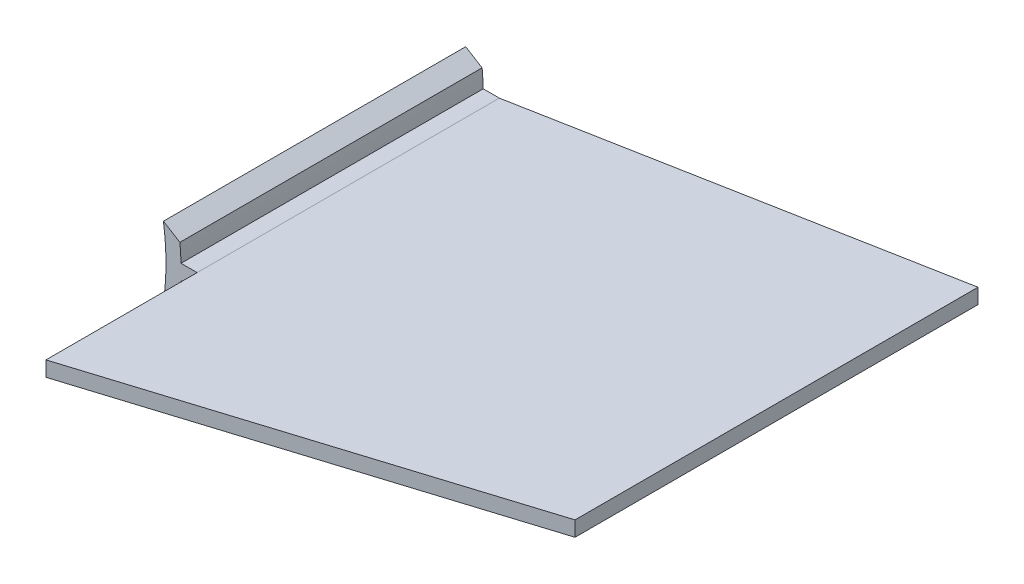
ISO-10303-21;
HEADER;
FILE_DESCRIPTION(('STEP AP214'),'2;1');
FILE_NAME('part.step','',(''),(''),'','','');
FILE_SCHEMA(('AUTOMOTIVE_DESIGN { 1 0 10303 214 1 1 1 1 }'));
ENDSEC;
DATA;
#1=APPLICATION_CONTEXT('core data for automotive mechanical design processes');
#2=APPLICATION_PROTOCOL_DEFINITION('international standard','automotive_design',2000,#1);
#3=PRODUCT_CONTEXT('',#1,'mechanical');
#4=PRODUCT('Part','Part','',(#3));
#5=PRODUCT_RELATED_PRODUCT_CATEGORY('part','',(#4));
#6=PRODUCT_DEFINITION_FORMATION('','',#4);
#7=PRODUCT_DEFINITION_CONTEXT('part definition',#1,'design');
#8=PRODUCT_DEFINITION('design','',#6,#7);
#9=PRODUCT_DEFINITION_SHAPE('','',#8);
#10=(LENGTH_UNIT() NAMED_UNIT(*) SI_UNIT(.MILLI.,.METRE.));
#11=(NAMED_UNIT(*) PLANE_ANGLE_UNIT() SI_UNIT($,.RADIAN.));
#12=(NAMED_UNIT(*) SI_UNIT($,.STERADIAN.) SOLID_ANGLE_UNIT());
#13=UNCERTAINTY_MEASURE_WITH_UNIT(LENGTH_MEASURE(1.E-05),#10,'distance_accuracy_value','');
#14=(GEOMETRIC_REPRESENTATION_CONTEXT(3) GLOBAL_UNCERTAINTY_ASSIGNED_CONTEXT((#13)) GLOBAL_UNIT_ASSIGNED_CONTEXT((#10,
#11,#12)) REPRESENTATION_CONTEXT('',''));
#15=CARTESIAN_POINT('',(0.,0.,0.));
#16=DIRECTION('',(0.,0.,1.));
#17=DIRECTION('',(1.,0.,0.));
#18=AXIS2_PLACEMENT_3D('',#15,#16,#17);
#19=CARTESIAN_POINT('',(0.,0.,60.));
#20=DIRECTION('',(0.,0.,-1.));
#21=DIRECTION('',(-1.,0.,0.));
#22=AXIS2_PLACEMENT_3D('',#19,#20,#21);
#23=CYLINDRICAL_SURFACE('',#22,51.8);
#24=CARTESIAN_POINT('',(0.,0.,0.));
#25=DIRECTION('',(0.,0.,1.));
#26=DIRECTION('',(-1.,0.,0.));
#27=AXIS2_PLACEMENT_3D('',#24,#25,#26);
#28=CIRCLE('',#27,51.8);
#29=CARTESIAN_POINT('',(51.558122541458,-4.99999999999998,0.));
#30=VERTEX_POINT('',#29);
#31=CARTESIAN_POINT('',(51.7782772984965,-1.5,0.));
#32=VERTEX_POINT('',#31);
#33=EDGE_CURVE('E153',#30,#32,#28,.T.);
#34=ORIENTED_EDGE('',*,*,#33,.T.);
#35=DIRECTION('',(0.,0.,-1.));
#36=VECTOR('',#35,1.);
#37=CARTESIAN_POINT('',(51.7782772984965,-1.5,60.));
#38=LINE('',#37,#36);
#39=CARTESIAN_POINT('',(51.7782772984965,-1.5,60.));
#40=VERTEX_POINT('',#39);
#41=EDGE_CURVE('E12',#40,#32,#38,.T.);
#42=ORIENTED_EDGE('',*,*,#41,.F.);
#43=CARTESIAN_POINT('',(0.,0.,60.));
#44=DIRECTION('',(0.,0.,1.));
#45=DIRECTION('',(-1.,0.,0.));
#46=AXIS2_PLACEMENT_3D('',#43,#44,#45);
#47=CIRCLE('',#46,51.8);
#48=CARTESIAN_POINT('',(51.558122541458,-4.99999999999998,60.));
#49=VERTEX_POINT('',#48);
#50=EDGE_CURVE('E167',#49,#40,#47,.T.);
#51=ORIENTED_EDGE('',*,*,#50,.F.);
#52=DIRECTION('',(0.,0.,-1.));
#53=VECTOR('',#52,1.);
#54=CARTESIAN_POINT('',(51.558122541458,-4.99999999999998,60.));
#55=LINE('',#54,#53);
#56=EDGE_CURVE('E149',#49,#30,#55,.T.);
#57=ORIENTED_EDGE('',*,*,#56,.T.);
#58=EDGE_LOOP('',(#34,#42,#51,#57));
#59=FACE_BOUND('',#58,.T.);
#60=ADVANCED_FACE('F57',(#59),#23,.T.);
#61=CARTESIAN_POINT('',(51.7782772984965,-1.5,60.));
#62=DIRECTION('',(0.,1.,0.));
#63=DIRECTION('',(0.,0.,1.));
#64=AXIS2_PLACEMENT_3D('',#61,#62,#63);
#65=PLANE('',#64);
#66=DIRECTION('',(1.,0.,0.));
#67=VECTOR('',#66,1.);
#68=CARTESIAN_POINT('',(51.7782772984965,-1.5,0.));
#69=LINE('',#68,#67);
#70=CARTESIAN_POINT('',(54.9795416495991,-1.50000000000003,0.));
#71=VERTEX_POINT('',#70);
#72=EDGE_CURVE('E156',#32,#71,#69,.T.);
#73=ORIENTED_EDGE('',*,*,#72,.T.);
#74=DIRECTION('',(0.,0.,-1.));
#75=VECTOR('',#74,1.);
#76=CARTESIAN_POINT('',(54.9795416495991,-1.50000000000003,60.));
#77=LINE('',#76,#75);
#78=CARTESIAN_POINT('',(54.9795416495991,-1.50000000000003,60.));
#79=VERTEX_POINT('',#78);
#80=EDGE_CURVE('E65',#79,#71,#77,.T.);
#81=ORIENTED_EDGE('',*,*,#80,.F.);
#82=DIRECTION('',(1.,0.,0.));
#83=VECTOR('',#82,1.);
#84=CARTESIAN_POINT('',(51.7782772984965,-1.5,60.));
#85=LINE('',#84,#83);
#86=EDGE_CURVE('E116',#40,#79,#85,.T.);
#87=ORIENTED_EDGE('',*,*,#86,.F.);
#88=ORIENTED_EDGE('',*,*,#41,.T.);
#89=EDGE_LOOP('',(#73,#81,#87,#88));
#90=FACE_BOUND('',#89,.T.);
#91=ADVANCED_FACE('F202',(#90),#65,.F.);
#92=CARTESIAN_POINT('',(0.,0.,60.));
#93=DIRECTION('',(0.,0.,-1.));
#94=DIRECTION('',(-1.,0.,0.));
#95=AXIS2_PLACEMENT_3D('',#92,#93,#94);
#96=CYLINDRICAL_SURFACE('',#95,55.);
#97=CARTESIAN_POINT('',(0.,0.,0.));
#98=DIRECTION('',(0.,0.,1.));
#99=DIRECTION('',(1.,0.,0.));
#100=AXIS2_PLACEMENT_3D('',#97,#98,#99);
#101=CIRCLE('',#100,55.);
#102=CARTESIAN_POINT('',(54.9795416495991,1.5,0.));
#103=VERTEX_POINT('',#102);
#104=EDGE_CURVE('E158',#71,#103,#101,.T.);
#105=ORIENTED_EDGE('',*,*,#104,.T.);
#106=DIRECTION('',(0.,0.,-1.));
#107=VECTOR('',#106,1.);
#108=CARTESIAN_POINT('',(54.9795416495991,1.5,60.));
#109=LINE('',#108,#107);
#110=CARTESIAN_POINT('',(54.9795416495991,1.5,60.));
#111=VERTEX_POINT('',#110);
#112=EDGE_CURVE('E174',#111,#103,#109,.T.);
#113=ORIENTED_EDGE('',*,*,#112,.F.);
#114=CARTESIAN_POINT('',(0.,0.,60.));
#115=DIRECTION('',(0.,0.,1.));
#116=DIRECTION('',(1.,0.,0.));
#117=AXIS2_PLACEMENT_3D('',#114,#115,#116);
#118=CIRCLE('',#117,55.);
#119=EDGE_CURVE('E182',#79,#111,#118,.T.);
#120=ORIENTED_EDGE('',*,*,#119,.F.);
#121=ORIENTED_EDGE('',*,*,#80,.T.);
#122=EDGE_LOOP('',(#105,#113,#120,#121));
#123=FACE_BOUND('',#122,.T.);
#124=ADVANCED_FACE('F180',(#123),#96,.T.);
#125=CARTESIAN_POINT('',(51.7782772984965,1.5,60.));
#126=DIRECTION('',(0.,-1.,0.));
#127=DIRECTION('',(0.,0.,-1.));
#128=AXIS2_PLACEMENT_3D('',#125,#126,#127);
#129=PLANE('',#128);
#130=DIRECTION('',(-1.,0.,0.));
#131=VECTOR('',#130,1.);
#132=CARTESIAN_POINT('',(51.7782772984965,1.5,0.));
#133=LINE('',#132,#131);
#134=CARTESIAN_POINT('',(51.7782772984965,1.5,0.));
#135=VERTEX_POINT('',#134);
#136=EDGE_CURVE('E160',#103,#135,#133,.T.);
#137=ORIENTED_EDGE('',*,*,#136,.T.);
#138=DIRECTION('',(0.,0.,-1.));
#139=VECTOR('',#138,1.);
#140=CARTESIAN_POINT('',(51.7782772984965,1.5,60.));
#141=LINE('',#140,#139);
#142=CARTESIAN_POINT('',(51.7782772984965,1.5,60.));
#143=VERTEX_POINT('',#142);
#144=EDGE_CURVE('E171',#143,#135,#141,.T.);
#145=ORIENTED_EDGE('',*,*,#144,.F.);
#146=DIRECTION('',(-1.,0.,0.));
#147=VECTOR('',#146,1.);
#148=CARTESIAN_POINT('',(51.7782772984965,1.5,60.));
#149=LINE('',#148,#147);
#150=EDGE_CURVE('E194',#111,#143,#149,.T.);
#151=ORIENTED_EDGE('',*,*,#150,.F.);
#152=ORIENTED_EDGE('',*,*,#112,.T.);
#153=EDGE_LOOP('',(#137,#145,#151,#152));
#154=FACE_BOUND('',#153,.T.);
#155=ADVANCED_FACE('F190',(#154),#129,.F.);
#156=CARTESIAN_POINT('',(0.,0.,60.));
#157=DIRECTION('',(0.,0.,-1.));
#158=DIRECTION('',(-1.,0.,0.));
#159=AXIS2_PLACEMENT_3D('',#156,#157,#158);
#160=CYLINDRICAL_SURFACE('',#159,51.8);
#161=CARTESIAN_POINT('',(0.,0.,0.));
#162=DIRECTION('',(0.,0.,1.));
#163=DIRECTION('',(1.,0.,0.));
#164=AXIS2_PLACEMENT_3D('',#161,#162,#163);
#165=CIRCLE('',#164,51.8);
#166=CARTESIAN_POINT('',(51.558122541458,4.99999999999999,0.));
#167=VERTEX_POINT('',#166);
#168=EDGE_CURVE('E162',#135,#167,#165,.T.);
#169=ORIENTED_EDGE('',*,*,#168,.T.);
#170=DIRECTION('',(0.,0.,-1.));
#171=VECTOR('',#170,1.);
#172=CARTESIAN_POINT('',(51.558122541458,4.99999999999999,60.));
#173=LINE('',#172,#171);
#174=CARTESIAN_POINT('',(51.558122541458,4.99999999999999,60.));
#175=VERTEX_POINT('',#174);
#176=EDGE_CURVE('E144',#175,#167,#173,.T.);
#177=ORIENTED_EDGE('',*,*,#176,.F.);
#178=CARTESIAN_POINT('',(0.,0.,60.));
#179=DIRECTION('',(0.,0.,1.));
#180=DIRECTION('',(1.,0.,0.));
#181=AXIS2_PLACEMENT_3D('',#178,#179,#180);
#182=CIRCLE('',#181,51.8);
#183=EDGE_CURVE('E135',#143,#175,#182,.T.);
#184=ORIENTED_EDGE('',*,*,#183,.F.);
#185=ORIENTED_EDGE('',*,*,#144,.T.);
#186=EDGE_LOOP('',(#169,#177,#184,#185));
#187=FACE_BOUND('',#186,.T.);
#188=ADVANCED_FACE('F193',(#187),#160,.T.);
#189=CARTESIAN_POINT('',(51.558122541458,4.99999999999999,60.));
#190=DIRECTION('',(-0.522605917776291,-0.852574369017273,0.));
#191=DIRECTION('',(0.852574369017273,-0.522605917776291,0.));
#192=AXIS2_PLACEMENT_3D('',#189,#190,#191);
#193=PLANE('',#192);
#194=DIRECTION('',(-0.852574369017273,0.522605917776291,0.));
#195=VECTOR('',#194,1.);
#196=CARTESIAN_POINT('',(51.558122541458,4.99999999999999,0.));
#197=LINE('',#196,#195);
#198=CARTESIAN_POINT('',(48.2953413902418,6.99999999999999,0.));
#199=VERTEX_POINT('',#198);
#200=EDGE_CURVE('E143',#167,#199,#197,.T.);
#201=ORIENTED_EDGE('',*,*,#200,.T.);
#202=DIRECTION('',(0.,0.,-1.));
#203=VECTOR('',#202,1.);
#204=CARTESIAN_POINT('',(48.2953413902418,6.99999999999999,60.));
#205=LINE('',#204,#203);
#206=CARTESIAN_POINT('',(48.2953413902418,6.99999999999999,60.));
#207=VERTEX_POINT('',#206);
#208=EDGE_CURVE('E140',#207,#199,#205,.T.);
#209=ORIENTED_EDGE('',*,*,#208,.F.);
#210=DIRECTION('',(-0.852574369017273,0.522605917776291,0.));
#211=VECTOR('',#210,1.);
#212=CARTESIAN_POINT('',(51.558122541458,4.99999999999999,60.));
#213=LINE('',#212,#211);
#214=EDGE_CURVE('E129',#175,#207,#213,.T.);
#215=ORIENTED_EDGE('',*,*,#214,.F.);
#216=ORIENTED_EDGE('',*,*,#176,.T.);
#217=EDGE_LOOP('',(#201,#209,#215,#216));
#218=FACE_BOUND('',#217,.T.);
#219=ADVANCED_FACE('F141',(#218),#193,.F.);
#220=CARTESIAN_POINT('',(0.,0.,60.));
#221=DIRECTION('',(0.,0.,-1.));
#222=DIRECTION('',(-1.,0.,0.));
#223=AXIS2_PLACEMENT_3D('',#220,#221,#222);
#224=CYLINDRICAL_SURFACE('',#223,48.8);
#225=CARTESIAN_POINT('',(0.,0.,0.));
#226=DIRECTION('',(0.,0.,-1.));
#227=DIRECTION('',(1.,0.,0.));
#228=AXIS2_PLACEMENT_3D('',#225,#226,#227);
#229=CIRCLE('',#228,48.8);
#230=CARTESIAN_POINT('',(48.2953413902418,-6.99999999999998,0.));
#231=VERTEX_POINT('',#230);
#232=EDGE_CURVE('E102',#199,#231,#229,.T.);
#233=ORIENTED_EDGE('',*,*,#232,.T.);
#234=DIRECTION('',(0.,0.,-1.));
#235=VECTOR('',#234,1.);
#236=CARTESIAN_POINT('',(48.2953413902418,-6.99999999999998,60.));
#237=LINE('',#236,#235);
#238=CARTESIAN_POINT('',(48.2953413902418,-6.99999999999998,60.));
#239=VERTEX_POINT('',#238);
#240=EDGE_CURVE('E145',#239,#231,#237,.T.);
#241=ORIENTED_EDGE('',*,*,#240,.F.);
#242=CARTESIAN_POINT('',(0.,0.,60.));
#243=DIRECTION('',(0.,0.,-1.));
#244=DIRECTION('',(1.,0.,0.));
#245=AXIS2_PLACEMENT_3D('',#242,#243,#244);
#246=CIRCLE('',#245,48.8);
#247=EDGE_CURVE('E133',#207,#239,#246,.T.);
#248=ORIENTED_EDGE('',*,*,#247,.F.);
#249=ORIENTED_EDGE('',*,*,#208,.T.);
#250=EDGE_LOOP('',(#233,#241,#248,#249));
#251=FACE_BOUND('',#250,.T.);
#252=ADVANCED_FACE('F147',(#251),#224,.F.);
#253=CARTESIAN_POINT('',(51.558122541458,-4.99999999999998,60.));
#254=DIRECTION('',(-0.522605917776292,0.852574369017272,0.));
#255=DIRECTION('',(-0.852574369017272,-0.522605917776292,0.));
#256=AXIS2_PLACEMENT_3D('',#253,#254,#255);
#257=PLANE('',#256);
#258=DIRECTION('',(0.852574369017272,0.522605917776292,0.));
#259=VECTOR('',#258,1.);
#260=CARTESIAN_POINT('',(51.558122541458,-4.99999999999998,0.));
#261=LINE('',#260,#259);
#262=EDGE_CURVE('E108',#231,#30,#261,.T.);
#263=ORIENTED_EDGE('',*,*,#262,.T.);
#264=ORIENTED_EDGE('',*,*,#56,.F.);
#265=DIRECTION('',(0.852574369017272,0.522605917776292,0.));
#266=VECTOR('',#265,1.);
#267=CARTESIAN_POINT('',(51.558122541458,-4.99999999999998,60.));
#268=LINE('',#267,#266);
#269=EDGE_CURVE('E73',#239,#49,#268,.T.);
#270=ORIENTED_EDGE('',*,*,#269,.F.);
#271=ORIENTED_EDGE('',*,*,#240,.T.);
#272=EDGE_LOOP('',(#263,#264,#270,#271));
#273=FACE_BOUND('',#272,.T.);
#274=ADVANCED_FACE('F218',(#273),#257,.F.);
#275=CARTESIAN_POINT('',(0.,0.,60.));
#276=DIRECTION('',(0.,0.,-1.));
#277=DIRECTION('',(-1.,0.,0.));
#278=AXIS2_PLACEMENT_3D('',#275,#276,#277);
#279=PLANE('',#278);
#280=ORIENTED_EDGE('',*,*,#50,.T.);
#281=ORIENTED_EDGE('',*,*,#86,.T.);
#282=ORIENTED_EDGE('',*,*,#119,.T.);
#283=ORIENTED_EDGE('',*,*,#150,.T.);
#284=ORIENTED_EDGE('',*,*,#183,.T.);
#285=ORIENTED_EDGE('',*,*,#214,.T.);
#286=ORIENTED_EDGE('',*,*,#247,.T.);
#287=ORIENTED_EDGE('',*,*,#269,.T.);
#288=EDGE_LOOP('',(#280,#281,#282,#283,#284,#285,#286,#287));
#289=FACE_BOUND('',#288,.T.);
#290=ADVANCED_FACE('F131',(#289),#279,.F.);
#291=CARTESIAN_POINT('',(0.,0.,0.));
#292=DIRECTION('',(0.,0.,-1.));
#293=DIRECTION('',(-1.,0.,0.));
#294=AXIS2_PLACEMENT_3D('',#291,#292,#293);
#295=PLANE('',#294);
#296=ORIENTED_EDGE('',*,*,#33,.F.);
#297=ORIENTED_EDGE('',*,*,#262,.F.);
#298=ORIENTED_EDGE('',*,*,#232,.F.);
#299=ORIENTED_EDGE('',*,*,#200,.F.);
#300=ORIENTED_EDGE('',*,*,#168,.F.);
#301=ORIENTED_EDGE('',*,*,#136,.F.);
#302=ORIENTED_EDGE('',*,*,#104,.F.);
#303=ORIENTED_EDGE('',*,*,#72,.F.);
#304=EDGE_LOOP('',(#296,#297,#298,#299,#300,#301,#302,#303));
#305=FACE_BOUND('',#304,.T.);
#306=ADVANCED_FACE('F186',(#305),#295,.T.);
#307=CLOSED_SHELL('',(#60,#91,#124,#155,#188,#219,#252,#274,#290,#306));
#308=MANIFOLD_SOLID_BREP('B2',#307);
#309=CARTESIAN_POINT('',(0.,0.,0.));
#310=DIRECTION('',(0.,0.,1.));
#311=DIRECTION('',(1.,0.,0.));
#312=AXIS2_PLACEMENT_3D('',#309,#310,#311);
#313=PLANE('',#312);
#314=DIRECTION('',(0.,-1.,0.));
#315=VECTOR('',#314,1.);
#316=CARTESIAN_POINT('',(55.,1.5,0.));
#317=LINE('',#316,#315);
#318=CARTESIAN_POINT('',(55.,1.5,0.));
#319=VERTEX_POINT('',#318);
#320=CARTESIAN_POINT('',(55.,0.,0.));
#321=VERTEX_POINT('',#320);
#322=EDGE_CURVE('E366',#319,#321,#317,.T.);
#323=ORIENTED_EDGE('',*,*,#322,.T.);
#324=CARTESIAN_POINT('',(0.,0.,0.));
#325=DIRECTION('',(0.,0.,1.));
#326=DIRECTION('',(1.,0.,0.));
#327=AXIS2_PLACEMENT_3D('',#324,#325,#326);
#328=CIRCLE('',#327,55.);
#329=CARTESIAN_POINT('',(54.9795416495991,1.5,0.));
#330=VERTEX_POINT('',#329);
#331=EDGE_CURVE('E353',#321,#330,#328,.T.);
#332=ORIENTED_EDGE('',*,*,#331,.T.);
#333=DIRECTION('',(-1.,0.,0.));
#334=VECTOR('',#333,1.);
#335=CARTESIAN_POINT('',(53.,1.5,0.));
#336=LINE('',#335,#334);
#337=EDGE_CURVE('E370',#319,#330,#336,.T.);
#338=ORIENTED_EDGE('',*,*,#337,.F.);
#339=EDGE_LOOP('',(#323,#332,#338));
#340=FACE_BOUND('',#339,.T.);
#341=ADVANCED_FACE('F285',(#340),#313,.F.);
#342=DIRECTION('',(-1.,0.,0.));
#343=VECTOR('',#342,1.);
#344=CARTESIAN_POINT('',(53.,-1.5,0.));
#345=LINE('',#344,#343);
#346=CARTESIAN_POINT('',(55.,-1.5,0.));
#347=VERTEX_POINT('',#346);
#348=CARTESIAN_POINT('',(54.9795416495991,-1.5,0.));
#349=VERTEX_POINT('',#348);
#350=EDGE_CURVE('E363',#347,#349,#345,.T.);
#351=ORIENTED_EDGE('',*,*,#350,.T.);
#352=EDGE_CURVE('E355',#349,#321,#328,.T.);
#353=ORIENTED_EDGE('',*,*,#352,.T.);
#354=EDGE_CURVE('E331',#321,#347,#317,.T.);
#355=ORIENTED_EDGE('',*,*,#354,.T.);
#356=EDGE_LOOP('',(#351,#353,#355));
#357=FACE_BOUND('',#356,.T.);
#358=ADVANCED_FACE('F287',(#357),#313,.F.);
#359=CARTESIAN_POINT('',(55.,1.5,90.));
#360=DIRECTION('',(0.,0.,-1.));
#361=DIRECTION('',(-1.,0.,0.));
#362=AXIS2_PLACEMENT_3D('',#359,#360,#361);
#363=PLANE('',#362);
#364=DIRECTION('',(1.,0.,0.));
#365=VECTOR('',#364,1.);
#366=CARTESIAN_POINT('',(55.,1.5,90.));
#367=LINE('',#366,#365);
#368=CARTESIAN_POINT('',(54.9795416495991,1.5,90.));
#369=VERTEX_POINT('',#368);
#370=CARTESIAN_POINT('',(55.,1.5,90.));
#371=VERTEX_POINT('',#370);
#372=EDGE_CURVE('E338',#369,#371,#367,.T.);
#373=ORIENTED_EDGE('',*,*,#372,.F.);
#374=CARTESIAN_POINT('',(0.,0.,90.));
#375=DIRECTION('',(0.,0.,-1.));
#376=DIRECTION('',(-1.,0.,0.));
#377=AXIS2_PLACEMENT_3D('',#374,#375,#376);
#378=CIRCLE('',#377,55.);
#379=CARTESIAN_POINT('',(55.,0.,90.));
#380=VERTEX_POINT('',#379);
#381=EDGE_CURVE('E55',#369,#380,#378,.T.);
#382=ORIENTED_EDGE('',*,*,#381,.T.);
#383=DIRECTION('',(0.,-1.,0.));
#384=VECTOR('',#383,1.);
#385=CARTESIAN_POINT('',(55.,1.5,90.));
#386=LINE('',#385,#384);
#387=EDGE_CURVE('E381',#371,#380,#386,.T.);
#388=ORIENTED_EDGE('',*,*,#387,.F.);
#389=EDGE_LOOP('',(#373,#382,#388));
#390=FACE_BOUND('',#389,.T.);
#391=ADVANCED_FACE('F392',(#390),#363,.F.);
#392=CARTESIAN_POINT('',(0.,1.5,0.));
#393=DIRECTION('',(0.,-1.,0.));
#394=DIRECTION('',(0.,0.,-1.));
#395=AXIS2_PLACEMENT_3D('',#392,#393,#394);
#396=PLANE('',#395);
#397=ORIENTED_EDGE('',*,*,#337,.T.);
#398=DIRECTION('',(0.,0.,-1.));
#399=VECTOR('',#398,1.);
#400=CARTESIAN_POINT('',(54.9795416495991,1.5,190.));
#401=LINE('',#400,#399);
#402=EDGE_CURVE('E356',#330,#369,#401,.F.);
#403=ORIENTED_EDGE('',*,*,#402,.T.);
#404=ORIENTED_EDGE('',*,*,#372,.T.);
#405=DIRECTION('',(0.95447997803503,0.,-0.298274993135947));
#406=VECTOR('',#405,1.);
#407=CARTESIAN_POINT('',(55.,1.5,90.));
#408=LINE('',#407,#406);
#409=CARTESIAN_POINT('',(135.,1.5,65.));
#410=VERTEX_POINT('',#409);
#411=EDGE_CURVE('E393',#371,#410,#408,.T.);
#412=ORIENTED_EDGE('',*,*,#411,.T.);
#413=DIRECTION('',(0.,0.,-1.));
#414=VECTOR('',#413,1.);
#415=CARTESIAN_POINT('',(135.,1.5,65.));
#416=LINE('',#415,#414);
#417=CARTESIAN_POINT('',(135.,1.5,-15.));
#418=VERTEX_POINT('',#417);
#419=EDGE_CURVE('E395',#410,#418,#416,.T.);
#420=ORIENTED_EDGE('',*,*,#419,.T.);
#421=DIRECTION('',(-0.982872186934322,0.,0.184288535050185));
#422=VECTOR('',#421,1.);
#423=CARTESIAN_POINT('',(135.,1.5,-15.));
#424=LINE('',#423,#422);
#425=EDGE_CURVE('E309',#418,#319,#424,.T.);
#426=ORIENTED_EDGE('',*,*,#425,.T.);
#427=EDGE_LOOP('',(#397,#403,#404,#412,#420,#426));
#428=FACE_BOUND('',#427,.T.);
#429=ADVANCED_FACE('F415',(#428),#396,.F.);
#430=CARTESIAN_POINT('',(0.,-1.5,0.));
#431=DIRECTION('',(0.,-1.,0.));
#432=DIRECTION('',(0.,0.,-1.));
#433=AXIS2_PLACEMENT_3D('',#430,#431,#432);
#434=PLANE('',#433);
#435=DIRECTION('',(0.,0.,-1.));
#436=VECTOR('',#435,1.);
#437=CARTESIAN_POINT('',(54.9795416495991,-1.5,190.));
#438=LINE('',#437,#436);
#439=CARTESIAN_POINT('',(54.9795416495991,-1.5,90.));
#440=VERTEX_POINT('',#439);
#441=EDGE_CURVE('E300',#349,#440,#438,.F.);
#442=ORIENTED_EDGE('',*,*,#441,.F.);
#443=ORIENTED_EDGE('',*,*,#350,.F.);
#444=DIRECTION('',(-0.982872186934322,0.,0.184288535050185));
#445=VECTOR('',#444,1.);
#446=CARTESIAN_POINT('',(135.,-1.5,-15.));
#447=LINE('',#446,#445);
#448=CARTESIAN_POINT('',(135.,-1.5,-15.));
#449=VERTEX_POINT('',#448);
#450=EDGE_CURVE('E369',#449,#347,#447,.T.);
#451=ORIENTED_EDGE('',*,*,#450,.F.);
#452=DIRECTION('',(0.,0.,-1.));
#453=VECTOR('',#452,1.);
#454=CARTESIAN_POINT('',(135.,-1.5,65.));
#455=LINE('',#454,#453);
#456=CARTESIAN_POINT('',(135.,-1.5,65.));
#457=VERTEX_POINT('',#456);
#458=EDGE_CURVE('E404',#457,#449,#455,.T.);
#459=ORIENTED_EDGE('',*,*,#458,.F.);
#460=DIRECTION('',(0.95447997803503,0.,-0.298274993135947));
#461=VECTOR('',#460,1.);
#462=CARTESIAN_POINT('',(55.,-1.5,90.));
#463=LINE('',#462,#461);
#464=CARTESIAN_POINT('',(55.,-1.5,90.));
#465=VERTEX_POINT('',#464);
#466=EDGE_CURVE('E402',#465,#457,#463,.T.);
#467=ORIENTED_EDGE('',*,*,#466,.F.);
#468=DIRECTION('',(1.,0.,0.));
#469=VECTOR('',#468,1.);
#470=CARTESIAN_POINT('',(55.,-1.5,90.));
#471=LINE('',#470,#469);
#472=EDGE_CURVE('E360',#440,#465,#471,.T.);
#473=ORIENTED_EDGE('',*,*,#472,.F.);
#474=EDGE_LOOP('',(#442,#443,#451,#459,#467,#473));
#475=FACE_BOUND('',#474,.T.);
#476=ADVANCED_FACE('F412',(#475),#434,.T.);
#477=EDGE_CURVE('E380',#380,#465,#386,.T.);
#478=ORIENTED_EDGE('',*,*,#477,.F.);
#479=EDGE_CURVE('E289',#380,#440,#378,.T.);
#480=ORIENTED_EDGE('',*,*,#479,.T.);
#481=ORIENTED_EDGE('',*,*,#472,.T.);
#482=EDGE_LOOP('',(#478,#480,#481));
#483=FACE_BOUND('',#482,.T.);
#484=ADVANCED_FACE('F388',(#483),#363,.F.);
#485=CARTESIAN_POINT('',(55.,1.5,90.));
#486=DIRECTION('',(-0.298274993135947,0.,-0.95447997803503));
#487=DIRECTION('',(-0.95447997803503,0.,0.298274993135947));
#488=AXIS2_PLACEMENT_3D('',#485,#486,#487);
#489=PLANE('',#488);
#490=ORIENTED_EDGE('',*,*,#466,.T.);
#491=DIRECTION('',(0.,-1.,0.));
#492=VECTOR('',#491,1.);
#493=CARTESIAN_POINT('',(135.,1.5,65.));
#494=LINE('',#493,#492);
#495=EDGE_CURVE('E373',#410,#457,#494,.T.);
#496=ORIENTED_EDGE('',*,*,#495,.F.);
#497=ORIENTED_EDGE('',*,*,#411,.F.);
#498=ORIENTED_EDGE('',*,*,#387,.T.);
#499=ORIENTED_EDGE('',*,*,#477,.T.);
#500=EDGE_LOOP('',(#490,#496,#497,#498,#499));
#501=FACE_BOUND('',#500,.T.);
#502=ADVANCED_FACE('F414',(#501),#489,.F.);
#503=CARTESIAN_POINT('',(135.,1.5,65.));
#504=DIRECTION('',(-1.,0.,0.));
#505=DIRECTION('',(0.,0.,1.));
#506=AXIS2_PLACEMENT_3D('',#503,#504,#505);
#507=PLANE('',#506);
#508=ORIENTED_EDGE('',*,*,#458,.T.);
#509=DIRECTION('',(0.,-1.,0.));
#510=VECTOR('',#509,1.);
#511=CARTESIAN_POINT('',(135.,1.5,-15.));
#512=LINE('',#511,#510);
#513=EDGE_CURVE('E372',#418,#449,#512,.T.);
#514=ORIENTED_EDGE('',*,*,#513,.F.);
#515=ORIENTED_EDGE('',*,*,#419,.F.);
#516=ORIENTED_EDGE('',*,*,#495,.T.);
#517=EDGE_LOOP('',(#508,#514,#515,#516));
#518=FACE_BOUND('',#517,.T.);
#519=ADVANCED_FACE('F408',(#518),#507,.F.);
#520=CARTESIAN_POINT('',(135.,1.5,-15.));
#521=DIRECTION('',(0.184288535050185,0.,0.982872186934322));
#522=DIRECTION('',(0.982872186934322,0.,-0.184288535050185));
#523=AXIS2_PLACEMENT_3D('',#520,#521,#522);
#524=PLANE('',#523);
#525=ORIENTED_EDGE('',*,*,#450,.T.);
#526=ORIENTED_EDGE('',*,*,#354,.F.);
#527=ORIENTED_EDGE('',*,*,#322,.F.);
#528=ORIENTED_EDGE('',*,*,#425,.F.);
#529=ORIENTED_EDGE('',*,*,#513,.T.);
#530=EDGE_LOOP('',(#525,#526,#527,#528,#529));
#531=FACE_BOUND('',#530,.T.);
#532=ADVANCED_FACE('F365',(#531),#524,.F.);
#533=CARTESIAN_POINT('',(0.,0.,-106.8));
#534=DIRECTION('',(0.,0.,1.));
#535=DIRECTION('',(1.,0.,0.));
#536=AXIS2_PLACEMENT_3D('',#533,#534,#535);
#537=CYLINDRICAL_SURFACE('',#536,55.);
#538=ORIENTED_EDGE('',*,*,#331,.F.);
#539=ORIENTED_EDGE('',*,*,#352,.F.);
#540=ORIENTED_EDGE('',*,*,#441,.T.);
#541=ORIENTED_EDGE('',*,*,#479,.F.);
#542=ORIENTED_EDGE('',*,*,#381,.F.);
#543=ORIENTED_EDGE('',*,*,#402,.F.);
#544=EDGE_LOOP('',(#538,#539,#540,#541,#542,#543));
#545=FACE_BOUND('',#544,.T.);
#546=ADVANCED_FACE('F354',(#545),#537,.F.);
#547=CLOSED_SHELL('',(#341,#358,#391,#429,#476,#484,#502,#519,#532,#546));
#548=MANIFOLD_SOLID_BREP('B6',#547);
#549=ADVANCED_BREP_SHAPE_REPRESENTATION('',(#18,#308,#548),#14);
#550=SHAPE_DEFINITION_REPRESENTATION(#9,#549);
ENDSEC;
END-ISO-10303-21;
